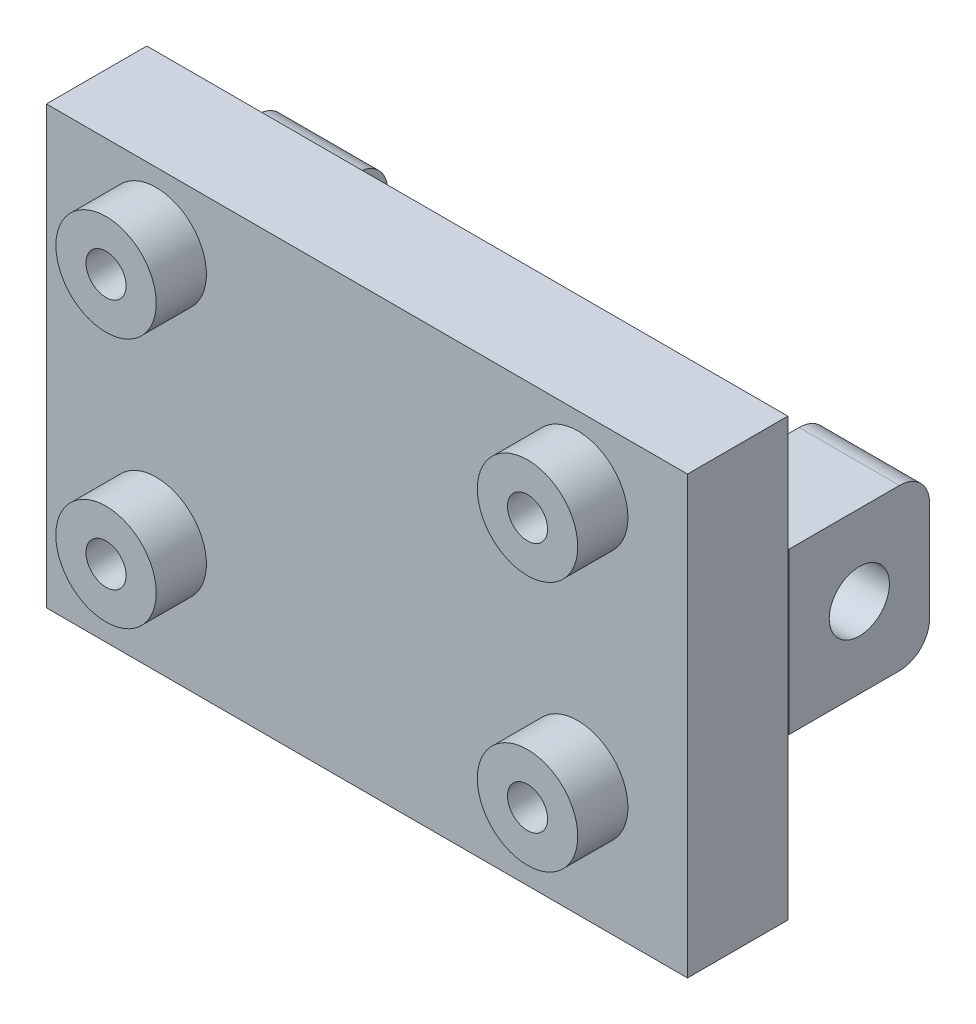
ISO-10303-21;
HEADER;
FILE_DESCRIPTION(('STEP AP214'),'2;1');
FILE_NAME('part.step','',(''),(''),'','','');
FILE_SCHEMA(('AUTOMOTIVE_DESIGN { 1 0 10303 214 1 1 1 1 }'));
ENDSEC;
DATA;
#1=APPLICATION_CONTEXT('core data for automotive mechanical design processes');
#2=APPLICATION_PROTOCOL_DEFINITION('international standard','automotive_design',2000,#1);
#3=PRODUCT_CONTEXT('',#1,'mechanical');
#4=PRODUCT('Part','Part','',(#3));
#5=PRODUCT_RELATED_PRODUCT_CATEGORY('part','',(#4));
#6=PRODUCT_DEFINITION_FORMATION('','',#4);
#7=PRODUCT_DEFINITION_CONTEXT('part definition',#1,'design');
#8=PRODUCT_DEFINITION('design','',#6,#7);
#9=PRODUCT_DEFINITION_SHAPE('','',#8);
#10=(LENGTH_UNIT() NAMED_UNIT(*) SI_UNIT(.MILLI.,.METRE.));
#11=(NAMED_UNIT(*) PLANE_ANGLE_UNIT() SI_UNIT($,.RADIAN.));
#12=(NAMED_UNIT(*) SI_UNIT($,.STERADIAN.) SOLID_ANGLE_UNIT());
#13=UNCERTAINTY_MEASURE_WITH_UNIT(LENGTH_MEASURE(1.E-05),#10,'distance_accuracy_value','');
#14=(GEOMETRIC_REPRESENTATION_CONTEXT(3) GLOBAL_UNCERTAINTY_ASSIGNED_CONTEXT((#13)) GLOBAL_UNIT_ASSIGNED_CONTEXT((#10,
#11,#12)) REPRESENTATION_CONTEXT('',''));
#15=CARTESIAN_POINT('',(0.,0.,0.));
#16=DIRECTION('',(0.,0.,1.));
#17=DIRECTION('',(1.,0.,0.));
#18=AXIS2_PLACEMENT_3D('',#15,#16,#17);
#19=CARTESIAN_POINT('',(0.,0.,5.));
#20=DIRECTION('',(0.,0.,-1.));
#21=DIRECTION('',(-1.,0.,0.));
#22=AXIS2_PLACEMENT_3D('',#19,#20,#21);
#23=PLANE('',#22);
#24=CARTESIAN_POINT('',(-10.5,6.25,5.));
#25=DIRECTION('',(0.,0.,-1.));
#26=DIRECTION('',(-1.,0.,0.));
#27=AXIS2_PLACEMENT_3D('',#24,#25,#26);
#28=CIRCLE('',#27,2.5);
#29=CARTESIAN_POINT('',(-13.,6.25,5.));
#30=VERTEX_POINT('',#29);
#31=EDGE_CURVE('E12',#30,#30,#28,.F.);
#32=ORIENTED_EDGE('',*,*,#31,.F.);
#33=EDGE_LOOP('',(#32));
#34=FACE_BOUND('',#33,.T.);
#35=CARTESIAN_POINT('',(10.5,6.25,5.));
#36=DIRECTION('',(0.,0.,-1.));
#37=DIRECTION('',(-1.,0.,0.));
#38=AXIS2_PLACEMENT_3D('',#35,#36,#37);
#39=CIRCLE('',#38,2.5);
#40=CARTESIAN_POINT('',(8.,6.25,5.));
#41=VERTEX_POINT('',#40);
#42=EDGE_CURVE('E52',#41,#41,#39,.F.);
#43=ORIENTED_EDGE('',*,*,#42,.F.);
#44=EDGE_LOOP('',(#43));
#45=FACE_BOUND('',#44,.T.);
#46=CARTESIAN_POINT('',(10.5,-6.25,5.));
#47=DIRECTION('',(0.,0.,-1.));
#48=DIRECTION('',(-1.,0.,0.));
#49=AXIS2_PLACEMENT_3D('',#46,#47,#48);
#50=CIRCLE('',#49,2.5);
#51=CARTESIAN_POINT('',(8.,-6.25,5.));
#52=VERTEX_POINT('',#51);
#53=EDGE_CURVE('E348',#52,#52,#50,.F.);
#54=ORIENTED_EDGE('',*,*,#53,.F.);
#55=EDGE_LOOP('',(#54));
#56=FACE_BOUND('',#55,.T.);
#57=CARTESIAN_POINT('',(-10.5,-6.25,5.));
#58=DIRECTION('',(0.,0.,-1.));
#59=DIRECTION('',(-1.,0.,0.));
#60=AXIS2_PLACEMENT_3D('',#57,#58,#59);
#61=CIRCLE('',#60,2.5);
#62=CARTESIAN_POINT('',(-13.,-6.25,5.));
#63=VERTEX_POINT('',#62);
#64=EDGE_CURVE('E345',#63,#63,#61,.F.);
#65=ORIENTED_EDGE('',*,*,#64,.F.);
#66=EDGE_LOOP('',(#65));
#67=FACE_BOUND('',#66,.T.);
#68=DIRECTION('',(0.,1.,0.));
#69=VECTOR('',#68,1.);
#70=CARTESIAN_POINT('',(15.9697448708061,-12.1254026242814,5.));
#71=LINE('',#70,#69);
#72=CARTESIAN_POINT('',(15.9697448708061,-12.1254026242814,5.));
#73=VERTEX_POINT('',#72);
#74=CARTESIAN_POINT('',(15.9697448708061,9.61880173970602,5.));
#75=VERTEX_POINT('',#74);
#76=EDGE_CURVE('E312',#73,#75,#71,.T.);
#77=ORIENTED_EDGE('',*,*,#76,.T.);
#78=DIRECTION('',(-1.,0.,0.));
#79=VECTOR('',#78,1.);
#80=CARTESIAN_POINT('',(-15.9697448708061,9.61880173970602,5.));
#81=LINE('',#80,#79);
#82=CARTESIAN_POINT('',(-15.9697448708061,9.61880173970602,5.));
#83=VERTEX_POINT('',#82);
#84=EDGE_CURVE('E315',#75,#83,#81,.T.);
#85=ORIENTED_EDGE('',*,*,#84,.T.);
#86=DIRECTION('',(0.,-1.,0.));
#87=VECTOR('',#86,1.);
#88=CARTESIAN_POINT('',(-15.9697448708061,-12.1254026242814,5.));
#89=LINE('',#88,#87);
#90=CARTESIAN_POINT('',(-15.9697448708061,-12.1254026242814,5.));
#91=VERTEX_POINT('',#90);
#92=EDGE_CURVE('E318',#83,#91,#89,.T.);
#93=ORIENTED_EDGE('',*,*,#92,.T.);
#94=DIRECTION('',(1.,0.,0.));
#95=VECTOR('',#94,1.);
#96=CARTESIAN_POINT('',(-15.9697448708061,-12.1254026242814,5.));
#97=LINE('',#96,#95);
#98=EDGE_CURVE('E320',#91,#73,#97,.T.);
#99=ORIENTED_EDGE('',*,*,#98,.T.);
#100=EDGE_LOOP('',(#77,#85,#93,#99));
#101=FACE_BOUND('',#100,.T.);
#102=ADVANCED_FACE('F44',(#34,#45,#56,#67,#101),#23,.F.);
#103=CARTESIAN_POINT('',(0.,0.,0.));
#104=DIRECTION('',(0.,0.,-1.));
#105=DIRECTION('',(-1.,0.,0.));
#106=AXIS2_PLACEMENT_3D('',#103,#104,#105);
#107=PLANE('',#106);
#108=DIRECTION('',(-1.,0.,0.));
#109=VECTOR('',#108,1.);
#110=CARTESIAN_POINT('',(16.0302551291939,-4.09125720677993,0.));
#111=LINE('',#110,#109);
#112=CARTESIAN_POINT('',(15.9697448708061,-4.09125720677993,0.));
#113=VERTEX_POINT('',#112);
#114=CARTESIAN_POINT('',(11.0302551291939,-4.09125720677993,0.));
#115=VERTEX_POINT('',#114);
#116=EDGE_CURVE('E219',#113,#115,#111,.T.);
#117=ORIENTED_EDGE('',*,*,#116,.F.);
#118=DIRECTION('',(0.,1.,0.));
#119=VECTOR('',#118,1.);
#120=CARTESIAN_POINT('',(15.9697448708061,-12.1254026242814,0.));
#121=LINE('',#120,#119);
#122=CARTESIAN_POINT('',(15.9697448708061,-12.1254026242814,0.));
#123=VERTEX_POINT('',#122);
#124=EDGE_CURVE('E323',#123,#113,#121,.T.);
#125=ORIENTED_EDGE('',*,*,#124,.F.);
#126=DIRECTION('',(1.,0.,0.));
#127=VECTOR('',#126,1.);
#128=CARTESIAN_POINT('',(-15.9697448708061,-12.1254026242814,0.));
#129=LINE('',#128,#127);
#130=CARTESIAN_POINT('',(-15.9697448708061,-12.1254026242814,0.));
#131=VERTEX_POINT('',#130);
#132=EDGE_CURVE('E316',#131,#123,#129,.T.);
#133=ORIENTED_EDGE('',*,*,#132,.F.);
#134=DIRECTION('',(0.,-1.,0.));
#135=VECTOR('',#134,1.);
#136=CARTESIAN_POINT('',(-15.9697448708061,-12.1254026242814,0.));
#137=LINE('',#136,#135);
#138=CARTESIAN_POINT('',(-15.9697448708061,-4.09125720677993,0.));
#139=VERTEX_POINT('',#138);
#140=EDGE_CURVE('E329',#139,#131,#137,.T.);
#141=ORIENTED_EDGE('',*,*,#140,.F.);
#142=DIRECTION('',(-1.,0.,0.));
#143=VECTOR('',#142,1.);
#144=CARTESIAN_POINT('',(-10.9697448708061,-4.09125720677993,0.));
#145=LINE('',#144,#143);
#146=CARTESIAN_POINT('',(-10.9697448708061,-4.09125720677993,0.));
#147=VERTEX_POINT('',#146);
#148=EDGE_CURVE('E264',#147,#139,#145,.T.);
#149=ORIENTED_EDGE('',*,*,#148,.F.);
#150=DIRECTION('',(0.,1.,0.));
#151=VECTOR('',#150,1.);
#152=CARTESIAN_POINT('',(-10.9697448708061,-4.09125720677993,0.));
#153=LINE('',#152,#151);
#154=CARTESIAN_POINT('',(-10.9697448708061,3.90874279322007,0.));
#155=VERTEX_POINT('',#154);
#156=EDGE_CURVE('E232',#147,#155,#153,.T.);
#157=ORIENTED_EDGE('',*,*,#156,.T.);
#158=DIRECTION('',(-1.,0.,0.));
#159=VECTOR('',#158,1.);
#160=CARTESIAN_POINT('',(-10.9697448708061,3.90874279322007,0.));
#161=LINE('',#160,#159);
#162=CARTESIAN_POINT('',(-15.9697448708061,3.90874279322007,0.));
#163=VERTEX_POINT('',#162);
#164=EDGE_CURVE('E251',#155,#163,#161,.T.);
#165=ORIENTED_EDGE('',*,*,#164,.T.);
#166=CARTESIAN_POINT('',(-15.9697448708061,9.61880173970602,0.));
#167=VERTEX_POINT('',#166);
#168=EDGE_CURVE('E330',#167,#163,#137,.T.);
#169=ORIENTED_EDGE('',*,*,#168,.F.);
#170=DIRECTION('',(-1.,0.,0.));
#171=VECTOR('',#170,1.);
#172=CARTESIAN_POINT('',(-15.9697448708061,9.61880173970602,0.));
#173=LINE('',#172,#171);
#174=CARTESIAN_POINT('',(15.9697448708061,9.61880173970602,0.));
#175=VERTEX_POINT('',#174);
#176=EDGE_CURVE('E326',#175,#167,#173,.T.);
#177=ORIENTED_EDGE('',*,*,#176,.F.);
#178=CARTESIAN_POINT('',(15.9697448708061,3.90874279322007,0.));
#179=VERTEX_POINT('',#178);
#180=EDGE_CURVE('E311',#179,#175,#121,.T.);
#181=ORIENTED_EDGE('',*,*,#180,.F.);
#182=DIRECTION('',(-1.,0.,0.));
#183=VECTOR('',#182,1.);
#184=CARTESIAN_POINT('',(16.0302551291939,3.90874279322007,0.));
#185=LINE('',#184,#183);
#186=CARTESIAN_POINT('',(11.0302551291939,3.90874279322007,0.));
#187=VERTEX_POINT('',#186);
#188=EDGE_CURVE('E166',#179,#187,#185,.T.);
#189=ORIENTED_EDGE('',*,*,#188,.T.);
#190=DIRECTION('',(0.,1.,0.));
#191=VECTOR('',#190,1.);
#192=CARTESIAN_POINT('',(11.0302551291939,-4.09125720677993,0.));
#193=LINE('',#192,#191);
#194=EDGE_CURVE('E202',#115,#187,#193,.T.);
#195=ORIENTED_EDGE('',*,*,#194,.F.);
#196=EDGE_LOOP('',(#117,#125,#133,#141,#149,#157,#165,#169,#177,#181,#189,#195));
#197=FACE_BOUND('',#196,.T.);
#198=CARTESIAN_POINT('',(-10.5,-6.25,0.));
#199=DIRECTION('',(0.,0.,1.));
#200=DIRECTION('',(1.,0.,0.));
#201=AXIS2_PLACEMENT_3D('',#198,#199,#200);
#202=CIRCLE('',#201,1.);
#203=CARTESIAN_POINT('',(-9.5,-6.25,0.));
#204=VERTEX_POINT('',#203);
#205=EDGE_CURVE('E302',#204,#204,#202,.T.);
#206=ORIENTED_EDGE('',*,*,#205,.T.);
#207=EDGE_LOOP('',(#206));
#208=FACE_BOUND('',#207,.T.);
#209=CARTESIAN_POINT('',(10.5,6.25,0.));
#210=DIRECTION('',(0.,0.,1.));
#211=DIRECTION('',(1.,0.,0.));
#212=AXIS2_PLACEMENT_3D('',#209,#210,#211);
#213=CIRCLE('',#212,1.);
#214=CARTESIAN_POINT('',(11.5,6.25,0.));
#215=VERTEX_POINT('',#214);
#216=EDGE_CURVE('E308',#215,#215,#213,.T.);
#217=ORIENTED_EDGE('',*,*,#216,.T.);
#218=EDGE_LOOP('',(#217));
#219=FACE_BOUND('',#218,.T.);
#220=CARTESIAN_POINT('',(10.5,-6.25,0.));
#221=DIRECTION('',(0.,0.,1.));
#222=DIRECTION('',(1.,0.,0.));
#223=AXIS2_PLACEMENT_3D('',#220,#221,#222);
#224=CIRCLE('',#223,1.);
#225=CARTESIAN_POINT('',(11.5,-6.25,0.));
#226=VERTEX_POINT('',#225);
#227=EDGE_CURVE('E305',#226,#226,#224,.T.);
#228=ORIENTED_EDGE('',*,*,#227,.T.);
#229=EDGE_LOOP('',(#228));
#230=FACE_BOUND('',#229,.T.);
#231=CARTESIAN_POINT('',(-10.5,6.25,0.));
#232=DIRECTION('',(0.,0.,1.));
#233=DIRECTION('',(1.,0.,0.));
#234=AXIS2_PLACEMENT_3D('',#231,#232,#233);
#235=CIRCLE('',#234,1.);
#236=CARTESIAN_POINT('',(-9.5,6.25,0.));
#237=VERTEX_POINT('',#236);
#238=EDGE_CURVE('E299',#237,#237,#235,.T.);
#239=ORIENTED_EDGE('',*,*,#238,.T.);
#240=EDGE_LOOP('',(#239));
#241=FACE_BOUND('',#240,.T.);
#242=ADVANCED_FACE('F357',(#197,#208,#219,#230,#241),#107,.T.);
#243=CARTESIAN_POINT('',(15.9697448708061,-12.1254026242814,5.));
#244=DIRECTION('',(-1.,0.,0.));
#245=DIRECTION('',(0.,0.,1.));
#246=AXIS2_PLACEMENT_3D('',#243,#244,#245);
#247=PLANE('',#246);
#248=ORIENTED_EDGE('',*,*,#124,.T.);
#249=EDGE_CURVE('E327',#113,#179,#121,.T.);
#250=ORIENTED_EDGE('',*,*,#249,.T.);
#251=ORIENTED_EDGE('',*,*,#180,.T.);
#252=DIRECTION('',(0.,0.,-1.));
#253=VECTOR('',#252,1.);
#254=CARTESIAN_POINT('',(15.9697448708061,9.61880173970602,5.));
#255=LINE('',#254,#253);
#256=EDGE_CURVE('E342',#75,#175,#255,.T.);
#257=ORIENTED_EDGE('',*,*,#256,.F.);
#258=ORIENTED_EDGE('',*,*,#76,.F.);
#259=DIRECTION('',(0.,0.,-1.));
#260=VECTOR('',#259,1.);
#261=CARTESIAN_POINT('',(15.9697448708061,-12.1254026242814,5.));
#262=LINE('',#261,#260);
#263=EDGE_CURVE('E322',#73,#123,#262,.T.);
#264=ORIENTED_EDGE('',*,*,#263,.T.);
#265=EDGE_LOOP('',(#248,#250,#251,#257,#258,#264));
#266=FACE_BOUND('',#265,.T.);
#267=ADVANCED_FACE('F46',(#266),#247,.F.);
#268=CARTESIAN_POINT('',(-15.9697448708061,9.61880173970602,5.));
#269=DIRECTION('',(0.,-1.,0.));
#270=DIRECTION('',(0.,0.,-1.));
#271=AXIS2_PLACEMENT_3D('',#268,#269,#270);
#272=PLANE('',#271);
#273=ORIENTED_EDGE('',*,*,#176,.T.);
#274=DIRECTION('',(0.,0.,-1.));
#275=VECTOR('',#274,1.);
#276=CARTESIAN_POINT('',(-15.9697448708061,9.61880173970602,5.));
#277=LINE('',#276,#275);
#278=EDGE_CURVE('E339',#83,#167,#277,.T.);
#279=ORIENTED_EDGE('',*,*,#278,.F.);
#280=ORIENTED_EDGE('',*,*,#84,.F.);
#281=ORIENTED_EDGE('',*,*,#256,.T.);
#282=EDGE_LOOP('',(#273,#279,#280,#281));
#283=FACE_BOUND('',#282,.T.);
#284=ADVANCED_FACE('F373',(#283),#272,.F.);
#285=CARTESIAN_POINT('',(-15.9697448708061,-12.1254026242814,5.));
#286=DIRECTION('',(1.,0.,0.));
#287=DIRECTION('',(0.,0.,-1.));
#288=AXIS2_PLACEMENT_3D('',#285,#286,#287);
#289=PLANE('',#288);
#290=ORIENTED_EDGE('',*,*,#168,.T.);
#291=DIRECTION('',(0.,0.,-1.));
#292=VECTOR('',#291,1.);
#293=CARTESIAN_POINT('',(-15.9697448708061,3.90874279322007,-5.5));
#294=LINE('',#293,#292);
#295=CARTESIAN_POINT('',(-15.9697448708061,3.90874279322007,-5.5));
#296=VERTEX_POINT('',#295);
#297=EDGE_CURVE('E67',#163,#296,#294,.T.);
#298=ORIENTED_EDGE('',*,*,#297,.T.);
#299=CARTESIAN_POINT('',(-15.9697448708061,2.40874279322007,-5.5));
#300=DIRECTION('',(-1.,0.,0.));
#301=DIRECTION('',(0.,0.,-1.));
#302=AXIS2_PLACEMENT_3D('',#299,#300,#301);
#303=CIRCLE('',#302,1.5);
#304=CARTESIAN_POINT('',(-15.9697448708061,2.40874279322007,-7.));
#305=VERTEX_POINT('',#304);
#306=EDGE_CURVE('E253',#296,#305,#303,.T.);
#307=ORIENTED_EDGE('',*,*,#306,.T.);
#308=DIRECTION('',(0.,-1.,0.));
#309=VECTOR('',#308,1.);
#310=CARTESIAN_POINT('',(-15.9697448708061,-2.59125720677993,-7.));
#311=LINE('',#310,#309);
#312=CARTESIAN_POINT('',(-15.9697448708061,-2.59125720677993,-7.));
#313=VERTEX_POINT('',#312);
#314=EDGE_CURVE('E256',#305,#313,#311,.T.);
#315=ORIENTED_EDGE('',*,*,#314,.T.);
#316=CARTESIAN_POINT('',(-15.9697448708061,-2.59125720677993,-5.5));
#317=DIRECTION('',(-1.,0.,0.));
#318=DIRECTION('',(0.,0.,-1.));
#319=AXIS2_PLACEMENT_3D('',#316,#317,#318);
#320=CIRCLE('',#319,1.5);
#321=CARTESIAN_POINT('',(-15.9697448708061,-4.09125720677993,-5.5));
#322=VERTEX_POINT('',#321);
#323=EDGE_CURVE('E259',#313,#322,#320,.T.);
#324=ORIENTED_EDGE('',*,*,#323,.T.);
#325=DIRECTION('',(0.,0.,1.));
#326=VECTOR('',#325,1.);
#327=CARTESIAN_POINT('',(-15.9697448708061,-4.09125720677993,0.));
#328=LINE('',#327,#326);
#329=EDGE_CURVE('E236',#322,#139,#328,.T.);
#330=ORIENTED_EDGE('',*,*,#329,.T.);
#331=ORIENTED_EDGE('',*,*,#140,.T.);
#332=DIRECTION('',(0.,0.,-1.));
#333=VECTOR('',#332,1.);
#334=CARTESIAN_POINT('',(-15.9697448708061,-12.1254026242814,5.));
#335=LINE('',#334,#333);
#336=EDGE_CURVE('E336',#91,#131,#335,.T.);
#337=ORIENTED_EDGE('',*,*,#336,.F.);
#338=ORIENTED_EDGE('',*,*,#92,.F.);
#339=ORIENTED_EDGE('',*,*,#278,.T.);
#340=EDGE_LOOP('',(#290,#298,#307,#315,#324,#330,#331,#337,#338,#339));
#341=FACE_BOUND('',#340,.T.);
#342=CARTESIAN_POINT('',(-15.9697448708061,-0.0912572067799326,-3.5));
#343=DIRECTION('',(-1.,0.,0.));
#344=DIRECTION('',(0.,0.,1.));
#345=AXIS2_PLACEMENT_3D('',#342,#343,#344);
#346=CIRCLE('',#345,1.5);
#347=CARTESIAN_POINT('',(-15.9697448708061,-0.0912572067799326,-2.));
#348=VERTEX_POINT('',#347);
#349=EDGE_CURVE('E218',#348,#348,#346,.T.);
#350=ORIENTED_EDGE('',*,*,#349,.F.);
#351=EDGE_LOOP('',(#350));
#352=FACE_BOUND('',#351,.T.);
#353=ADVANCED_FACE('F378',(#341,#352),#289,.F.);
#354=CARTESIAN_POINT('',(-15.9697448708061,-12.1254026242814,5.));
#355=DIRECTION('',(0.,1.,0.));
#356=DIRECTION('',(0.,0.,1.));
#357=AXIS2_PLACEMENT_3D('',#354,#355,#356);
#358=PLANE('',#357);
#359=ORIENTED_EDGE('',*,*,#132,.T.);
#360=ORIENTED_EDGE('',*,*,#263,.F.);
#361=ORIENTED_EDGE('',*,*,#98,.F.);
#362=ORIENTED_EDGE('',*,*,#336,.T.);
#363=EDGE_LOOP('',(#359,#360,#361,#362));
#364=FACE_BOUND('',#363,.T.);
#365=ADVANCED_FACE('F383',(#364),#358,.F.);
#366=CARTESIAN_POINT('',(10.5,6.25,5.));
#367=DIRECTION('',(0.,0.,-1.));
#368=DIRECTION('',(-1.,0.,0.));
#369=AXIS2_PLACEMENT_3D('',#366,#367,#368);
#370=CYLINDRICAL_SURFACE('',#369,1.);
#371=ORIENTED_EDGE('',*,*,#216,.F.);
#372=EDGE_LOOP('',(#371));
#373=FACE_BOUND('',#372,.T.);
#374=CARTESIAN_POINT('',(10.5,6.25,7.5));
#375=DIRECTION('',(0.,0.,1.));
#376=DIRECTION('',(1.,0.,0.));
#377=AXIS2_PLACEMENT_3D('',#374,#375,#376);
#378=CIRCLE('',#377,1.);
#379=CARTESIAN_POINT('',(11.5,6.25,7.5));
#380=VERTEX_POINT('',#379);
#381=EDGE_CURVE('E280',#380,#380,#378,.F.);
#382=ORIENTED_EDGE('',*,*,#381,.F.);
#383=EDGE_LOOP('',(#382));
#384=FACE_BOUND('',#383,.T.);
#385=ADVANCED_FACE('F485',(#373,#384),#370,.F.);
#386=CARTESIAN_POINT('',(10.5,-6.25,5.));
#387=DIRECTION('',(0.,0.,-1.));
#388=DIRECTION('',(-1.,0.,0.));
#389=AXIS2_PLACEMENT_3D('',#386,#387,#388);
#390=CYLINDRICAL_SURFACE('',#389,1.);
#391=ORIENTED_EDGE('',*,*,#227,.F.);
#392=EDGE_LOOP('',(#391));
#393=FACE_BOUND('',#392,.T.);
#394=CARTESIAN_POINT('',(10.5,-6.25,7.5));
#395=DIRECTION('',(0.,0.,1.));
#396=DIRECTION('',(1.,0.,0.));
#397=AXIS2_PLACEMENT_3D('',#394,#395,#396);
#398=CIRCLE('',#397,1.);
#399=CARTESIAN_POINT('',(11.5,-6.25,7.5));
#400=VERTEX_POINT('',#399);
#401=EDGE_CURVE('E279',#400,#400,#398,.F.);
#402=ORIENTED_EDGE('',*,*,#401,.F.);
#403=EDGE_LOOP('',(#402));
#404=FACE_BOUND('',#403,.T.);
#405=ADVANCED_FACE('F481',(#393,#404),#390,.F.);
#406=CARTESIAN_POINT('',(-10.5,-6.25,5.));
#407=DIRECTION('',(0.,0.,-1.));
#408=DIRECTION('',(-1.,0.,0.));
#409=AXIS2_PLACEMENT_3D('',#406,#407,#408);
#410=CYLINDRICAL_SURFACE('',#409,1.);
#411=ORIENTED_EDGE('',*,*,#205,.F.);
#412=EDGE_LOOP('',(#411));
#413=FACE_BOUND('',#412,.T.);
#414=CARTESIAN_POINT('',(-10.5,-6.25,7.5));
#415=DIRECTION('',(0.,0.,1.));
#416=DIRECTION('',(1.,0.,0.));
#417=AXIS2_PLACEMENT_3D('',#414,#415,#416);
#418=CIRCLE('',#417,1.);
#419=CARTESIAN_POINT('',(-9.5,-6.25,7.5));
#420=VERTEX_POINT('',#419);
#421=EDGE_CURVE('E283',#420,#420,#418,.F.);
#422=ORIENTED_EDGE('',*,*,#421,.F.);
#423=EDGE_LOOP('',(#422));
#424=FACE_BOUND('',#423,.T.);
#425=ADVANCED_FACE('F477',(#413,#424),#410,.F.);
#426=CARTESIAN_POINT('',(-10.5,6.25,5.));
#427=DIRECTION('',(0.,0.,-1.));
#428=DIRECTION('',(-1.,0.,0.));
#429=AXIS2_PLACEMENT_3D('',#426,#427,#428);
#430=CYLINDRICAL_SURFACE('',#429,1.);
#431=ORIENTED_EDGE('',*,*,#238,.F.);
#432=EDGE_LOOP('',(#431));
#433=FACE_BOUND('',#432,.T.);
#434=CARTESIAN_POINT('',(-10.5,6.25,7.5));
#435=DIRECTION('',(0.,0.,1.));
#436=DIRECTION('',(1.,0.,0.));
#437=AXIS2_PLACEMENT_3D('',#434,#435,#436);
#438=CIRCLE('',#437,1.);
#439=CARTESIAN_POINT('',(-9.5,6.25,7.5));
#440=VERTEX_POINT('',#439);
#441=EDGE_CURVE('E287',#440,#440,#438,.T.);
#442=ORIENTED_EDGE('',*,*,#441,.T.);
#443=EDGE_LOOP('',(#442));
#444=FACE_BOUND('',#443,.T.);
#445=ADVANCED_FACE('F467',(#433,#444),#430,.F.);
#446=CARTESIAN_POINT('',(-10.5,6.25,7.5));
#447=DIRECTION('',(0.,0.,1.));
#448=DIRECTION('',(1.,0.,0.));
#449=AXIS2_PLACEMENT_3D('',#446,#447,#448);
#450=PLANE('',#449);
#451=CARTESIAN_POINT('',(-10.5,6.25,7.5));
#452=DIRECTION('',(0.,0.,1.));
#453=DIRECTION('',(1.,0.,0.));
#454=AXIS2_PLACEMENT_3D('',#451,#452,#453);
#455=CIRCLE('',#454,2.5);
#456=CARTESIAN_POINT('',(-8.,6.25,7.5));
#457=VERTEX_POINT('',#456);
#458=EDGE_CURVE('E266',#457,#457,#455,.T.);
#459=ORIENTED_EDGE('',*,*,#458,.T.);
#460=EDGE_LOOP('',(#459));
#461=FACE_BOUND('',#460,.T.);
#462=ORIENTED_EDGE('',*,*,#441,.F.);
#463=EDGE_LOOP('',(#462));
#464=FACE_BOUND('',#463,.T.);
#465=ADVANCED_FACE('F463',(#461,#464),#450,.T.);
#466=CARTESIAN_POINT('',(-10.5,6.25,7.5));
#467=DIRECTION('',(0.,0.,-1.));
#468=DIRECTION('',(-1.,0.,0.));
#469=AXIS2_PLACEMENT_3D('',#466,#467,#468);
#470=CYLINDRICAL_SURFACE('',#469,2.5);
#471=ORIENTED_EDGE('',*,*,#458,.F.);
#472=EDGE_LOOP('',(#471));
#473=FACE_BOUND('',#472,.T.);
#474=ORIENTED_EDGE('',*,*,#31,.T.);
#475=EDGE_LOOP('',(#474));
#476=FACE_BOUND('',#475,.T.);
#477=ADVANCED_FACE('F459',(#473,#476),#470,.T.);
#478=CARTESIAN_POINT('',(-10.5,-6.25,7.5));
#479=DIRECTION('',(0.,0.,-1.));
#480=DIRECTION('',(-1.,0.,0.));
#481=AXIS2_PLACEMENT_3D('',#478,#479,#480);
#482=CYLINDRICAL_SURFACE('',#481,2.5);
#483=CARTESIAN_POINT('',(-10.5,-6.25,7.5));
#484=DIRECTION('',(0.,0.,1.));
#485=DIRECTION('',(1.,0.,0.));
#486=AXIS2_PLACEMENT_3D('',#483,#484,#485);
#487=CIRCLE('',#486,2.5);
#488=CARTESIAN_POINT('',(-8.,-6.25,7.5));
#489=VERTEX_POINT('',#488);
#490=EDGE_CURVE('E296',#489,#489,#487,.T.);
#491=ORIENTED_EDGE('',*,*,#490,.F.);
#492=EDGE_LOOP('',(#491));
#493=FACE_BOUND('',#492,.T.);
#494=ORIENTED_EDGE('',*,*,#64,.T.);
#495=EDGE_LOOP('',(#494));
#496=FACE_BOUND('',#495,.T.);
#497=ADVANCED_FACE('F462',(#493,#496),#482,.T.);
#498=CARTESIAN_POINT('',(0.,0.,7.5));
#499=DIRECTION('',(0.,0.,1.));
#500=DIRECTION('',(1.,0.,0.));
#501=AXIS2_PLACEMENT_3D('',#498,#499,#500);
#502=PLANE('',#501);
#503=ORIENTED_EDGE('',*,*,#421,.T.);
#504=EDGE_LOOP('',(#503));
#505=FACE_BOUND('',#504,.T.);
#506=ORIENTED_EDGE('',*,*,#490,.T.);
#507=EDGE_LOOP('',(#506));
#508=FACE_BOUND('',#507,.T.);
#509=ADVANCED_FACE('F448',(#505,#508),#502,.T.);
#510=CARTESIAN_POINT('',(10.5,-6.25,7.5));
#511=DIRECTION('',(0.,0.,-1.));
#512=DIRECTION('',(-1.,0.,0.));
#513=AXIS2_PLACEMENT_3D('',#510,#511,#512);
#514=CYLINDRICAL_SURFACE('',#513,2.5);
#515=CARTESIAN_POINT('',(10.5,-6.25,7.5));
#516=DIRECTION('',(0.,0.,1.));
#517=DIRECTION('',(1.,0.,0.));
#518=AXIS2_PLACEMENT_3D('',#515,#516,#517);
#519=CIRCLE('',#518,2.5);
#520=CARTESIAN_POINT('',(13.,-6.25,7.5));
#521=VERTEX_POINT('',#520);
#522=EDGE_CURVE('E276',#521,#521,#519,.T.);
#523=ORIENTED_EDGE('',*,*,#522,.F.);
#524=EDGE_LOOP('',(#523));
#525=FACE_BOUND('',#524,.T.);
#526=ORIENTED_EDGE('',*,*,#53,.T.);
#527=EDGE_LOOP('',(#526));
#528=FACE_BOUND('',#527,.T.);
#529=ADVANCED_FACE('F444',(#525,#528),#514,.T.);
#530=CARTESIAN_POINT('',(0.,0.,7.5));
#531=DIRECTION('',(0.,0.,1.));
#532=DIRECTION('',(1.,0.,0.));
#533=AXIS2_PLACEMENT_3D('',#530,#531,#532);
#534=PLANE('',#533);
#535=ORIENTED_EDGE('',*,*,#401,.T.);
#536=EDGE_LOOP('',(#535));
#537=FACE_BOUND('',#536,.T.);
#538=ORIENTED_EDGE('',*,*,#522,.T.);
#539=EDGE_LOOP('',(#538));
#540=FACE_BOUND('',#539,.T.);
#541=ADVANCED_FACE('F447',(#537,#540),#534,.T.);
#542=CARTESIAN_POINT('',(10.5,6.25,7.5));
#543=DIRECTION('',(0.,0.,-1.));
#544=DIRECTION('',(-1.,0.,0.));
#545=AXIS2_PLACEMENT_3D('',#542,#543,#544);
#546=CYLINDRICAL_SURFACE('',#545,2.5);
#547=CARTESIAN_POINT('',(10.5,6.25,7.5));
#548=DIRECTION('',(0.,0.,1.));
#549=DIRECTION('',(1.,0.,0.));
#550=AXIS2_PLACEMENT_3D('',#547,#548,#549);
#551=CIRCLE('',#550,2.5);
#552=CARTESIAN_POINT('',(13.,6.25,7.5));
#553=VERTEX_POINT('',#552);
#554=EDGE_CURVE('E284',#553,#553,#551,.T.);
#555=ORIENTED_EDGE('',*,*,#554,.F.);
#556=EDGE_LOOP('',(#555));
#557=FACE_BOUND('',#556,.T.);
#558=ORIENTED_EDGE('',*,*,#42,.T.);
#559=EDGE_LOOP('',(#558));
#560=FACE_BOUND('',#559,.T.);
#561=ADVANCED_FACE('F353',(#557,#560),#546,.T.);
#562=CARTESIAN_POINT('',(0.,0.,7.5));
#563=DIRECTION('',(0.,0.,1.));
#564=DIRECTION('',(1.,0.,0.));
#565=AXIS2_PLACEMENT_3D('',#562,#563,#564);
#566=PLANE('',#565);
#567=ORIENTED_EDGE('',*,*,#381,.T.);
#568=EDGE_LOOP('',(#567));
#569=FACE_BOUND('',#568,.T.);
#570=ORIENTED_EDGE('',*,*,#554,.T.);
#571=EDGE_LOOP('',(#570));
#572=FACE_BOUND('',#571,.T.);
#573=ADVANCED_FACE('F429',(#569,#572),#566,.T.);
#574=CARTESIAN_POINT('',(-10.9697448708061,-4.09125720677993,0.));
#575=DIRECTION('',(0.,-1.,0.));
#576=DIRECTION('',(0.,0.,-1.));
#577=AXIS2_PLACEMENT_3D('',#574,#575,#576);
#578=PLANE('',#577);
#579=ORIENTED_EDGE('',*,*,#329,.F.);
#580=DIRECTION('',(-1.,0.,0.));
#581=VECTOR('',#580,1.);
#582=CARTESIAN_POINT('',(-10.9697448708061,-4.09125720677993,-5.5));
#583=LINE('',#582,#581);
#584=CARTESIAN_POINT('',(-10.9697448708061,-4.09125720677993,-5.5));
#585=VERTEX_POINT('',#584);
#586=EDGE_CURVE('E267',#585,#322,#583,.T.);
#587=ORIENTED_EDGE('',*,*,#586,.F.);
#588=DIRECTION('',(0.,0.,1.));
#589=VECTOR('',#588,1.);
#590=CARTESIAN_POINT('',(-10.9697448708061,-4.09125720677993,0.));
#591=LINE('',#590,#589);
#592=EDGE_CURVE('E248',#585,#147,#591,.T.);
#593=ORIENTED_EDGE('',*,*,#592,.T.);
#594=ORIENTED_EDGE('',*,*,#148,.T.);
#595=EDGE_LOOP('',(#579,#587,#593,#594));
#596=FACE_BOUND('',#595,.T.);
#597=ADVANCED_FACE('F425',(#596),#578,.T.);
#598=CARTESIAN_POINT('',(-10.9697448708061,-2.59125720677993,-5.5));
#599=DIRECTION('',(-1.,0.,0.));
#600=DIRECTION('',(0.,0.,1.));
#601=AXIS2_PLACEMENT_3D('',#598,#599,#600);
#602=CYLINDRICAL_SURFACE('',#601,1.5);
#603=ORIENTED_EDGE('',*,*,#323,.F.);
#604=DIRECTION('',(-1.,0.,0.));
#605=VECTOR('',#604,1.);
#606=CARTESIAN_POINT('',(-10.9697448708061,-2.59125720677993,-7.));
#607=LINE('',#606,#605);
#608=CARTESIAN_POINT('',(-10.9697448708061,-2.59125720677993,-7.));
#609=VERTEX_POINT('',#608);
#610=EDGE_CURVE('E269',#609,#313,#607,.T.);
#611=ORIENTED_EDGE('',*,*,#610,.F.);
#612=CARTESIAN_POINT('',(-10.9697448708061,-2.59125720677993,-5.5));
#613=DIRECTION('',(-1.,0.,0.));
#614=DIRECTION('',(0.,0.,-1.));
#615=AXIS2_PLACEMENT_3D('',#612,#613,#614);
#616=CIRCLE('',#615,1.5);
#617=EDGE_CURVE('E245',#609,#585,#616,.T.);
#618=ORIENTED_EDGE('',*,*,#617,.T.);
#619=ORIENTED_EDGE('',*,*,#586,.T.);
#620=EDGE_LOOP('',(#603,#611,#618,#619));
#621=FACE_BOUND('',#620,.T.);
#622=ADVANCED_FACE('F428',(#621),#602,.T.);
#623=CARTESIAN_POINT('',(-10.9697448708061,-2.59125720677993,-7.));
#624=DIRECTION('',(0.,0.,-1.));
#625=DIRECTION('',(-1.,0.,0.));
#626=AXIS2_PLACEMENT_3D('',#623,#624,#625);
#627=PLANE('',#626);
#628=ORIENTED_EDGE('',*,*,#314,.F.);
#629=DIRECTION('',(-1.,0.,0.));
#630=VECTOR('',#629,1.);
#631=CARTESIAN_POINT('',(-10.9697448708061,2.40874279322007,-7.));
#632=LINE('',#631,#630);
#633=CARTESIAN_POINT('',(-10.9697448708061,2.40874279322007,-7.));
#634=VERTEX_POINT('',#633);
#635=EDGE_CURVE('E271',#634,#305,#632,.T.);
#636=ORIENTED_EDGE('',*,*,#635,.F.);
#637=DIRECTION('',(0.,-1.,0.));
#638=VECTOR('',#637,1.);
#639=CARTESIAN_POINT('',(-10.9697448708061,-2.59125720677993,-7.));
#640=LINE('',#639,#638);
#641=EDGE_CURVE('E242',#634,#609,#640,.T.);
#642=ORIENTED_EDGE('',*,*,#641,.T.);
#643=ORIENTED_EDGE('',*,*,#610,.T.);
#644=EDGE_LOOP('',(#628,#636,#642,#643));
#645=FACE_BOUND('',#644,.T.);
#646=ADVANCED_FACE('F433',(#645),#627,.T.);
#647=CARTESIAN_POINT('',(-10.9697448708061,2.40874279322007,-5.5));
#648=DIRECTION('',(-1.,0.,0.));
#649=DIRECTION('',(0.,0.,1.));
#650=AXIS2_PLACEMENT_3D('',#647,#648,#649);
#651=CYLINDRICAL_SURFACE('',#650,1.5);
#652=ORIENTED_EDGE('',*,*,#306,.F.);
#653=DIRECTION('',(-1.,0.,0.));
#654=VECTOR('',#653,1.);
#655=CARTESIAN_POINT('',(-10.9697448708061,3.90874279322007,-5.5));
#656=LINE('',#655,#654);
#657=CARTESIAN_POINT('',(-10.9697448708061,3.90874279322007,-5.5));
#658=VERTEX_POINT('',#657);
#659=EDGE_CURVE('E273',#658,#296,#656,.T.);
#660=ORIENTED_EDGE('',*,*,#659,.F.);
#661=CARTESIAN_POINT('',(-10.9697448708061,2.40874279322007,-5.5));
#662=DIRECTION('',(-1.,0.,0.));
#663=DIRECTION('',(0.,0.,-1.));
#664=AXIS2_PLACEMENT_3D('',#661,#662,#663);
#665=CIRCLE('',#664,1.5);
#666=EDGE_CURVE('E239',#658,#634,#665,.T.);
#667=ORIENTED_EDGE('',*,*,#666,.T.);
#668=ORIENTED_EDGE('',*,*,#635,.T.);
#669=EDGE_LOOP('',(#652,#660,#667,#668));
#670=FACE_BOUND('',#669,.T.);
#671=ADVANCED_FACE('F437',(#670),#651,.T.);
#672=CARTESIAN_POINT('',(-10.9697448708061,3.90874279322007,-5.5));
#673=DIRECTION('',(0.,1.,0.));
#674=DIRECTION('',(0.,0.,1.));
#675=AXIS2_PLACEMENT_3D('',#672,#673,#674);
#676=PLANE('',#675);
#677=ORIENTED_EDGE('',*,*,#297,.F.);
#678=ORIENTED_EDGE('',*,*,#164,.F.);
#679=DIRECTION('',(0.,0.,-1.));
#680=VECTOR('',#679,1.);
#681=CARTESIAN_POINT('',(-10.9697448708061,3.90874279322007,-5.5));
#682=LINE('',#681,#680);
#683=EDGE_CURVE('E235',#155,#658,#682,.T.);
#684=ORIENTED_EDGE('',*,*,#683,.T.);
#685=ORIENTED_EDGE('',*,*,#659,.T.);
#686=EDGE_LOOP('',(#677,#678,#684,#685));
#687=FACE_BOUND('',#686,.T.);
#688=ADVANCED_FACE('F423',(#687),#676,.T.);
#689=CARTESIAN_POINT('',(-10.9697448708061,2.40874279322007,-5.5));
#690=DIRECTION('',(1.,0.,0.));
#691=DIRECTION('',(0.,0.,-1.));
#692=AXIS2_PLACEMENT_3D('',#689,#690,#691);
#693=PLANE('',#692);
#694=CARTESIAN_POINT('',(-10.9697448708061,-0.0912572067799326,-3.5));
#695=DIRECTION('',(-1.,0.,0.));
#696=DIRECTION('',(0.,0.,1.));
#697=AXIS2_PLACEMENT_3D('',#694,#695,#696);
#698=CIRCLE('',#697,1.5);
#699=CARTESIAN_POINT('',(-10.9697448708061,-0.0912572067799326,-2.));
#700=VERTEX_POINT('',#699);
#701=EDGE_CURVE('E227',#700,#700,#698,.T.);
#702=ORIENTED_EDGE('',*,*,#701,.T.);
#703=EDGE_LOOP('',(#702));
#704=FACE_BOUND('',#703,.T.);
#705=ORIENTED_EDGE('',*,*,#156,.F.);
#706=ORIENTED_EDGE('',*,*,#592,.F.);
#707=ORIENTED_EDGE('',*,*,#617,.F.);
#708=ORIENTED_EDGE('',*,*,#641,.F.);
#709=ORIENTED_EDGE('',*,*,#666,.F.);
#710=ORIENTED_EDGE('',*,*,#683,.F.);
#711=EDGE_LOOP('',(#705,#706,#707,#708,#709,#710));
#712=FACE_BOUND('',#711,.T.);
#713=ADVANCED_FACE('F419',(#704,#712),#693,.T.);
#714=CARTESIAN_POINT('',(-10.9697448708061,-0.0912572067799326,-3.5));
#715=DIRECTION('',(-1.,0.,0.));
#716=DIRECTION('',(0.,0.,1.));
#717=AXIS2_PLACEMENT_3D('',#714,#715,#716);
#718=CYLINDRICAL_SURFACE('',#717,1.5);
#719=ORIENTED_EDGE('',*,*,#701,.F.);
#720=EDGE_LOOP('',(#719));
#721=FACE_BOUND('',#720,.T.);
#722=ORIENTED_EDGE('',*,*,#349,.T.);
#723=EDGE_LOOP('',(#722));
#724=FACE_BOUND('',#723,.T.);
#725=ADVANCED_FACE('F416',(#721,#724),#718,.F.);
#726=CARTESIAN_POINT('',(16.0302551291939,-4.09125720677993,0.));
#727=DIRECTION('',(0.,0.,1.));
#728=DIRECTION('',(1.,0.,0.));
#729=AXIS2_PLACEMENT_3D('',#726,#727,#728);
#730=PLANE('',#729);
#731=ORIENTED_EDGE('',*,*,#249,.F.);
#732=CARTESIAN_POINT('',(16.0302551291939,-4.09125720677993,0.));
#733=VERTEX_POINT('',#732);
#734=EDGE_CURVE('E183',#733,#113,#111,.T.);
#735=ORIENTED_EDGE('',*,*,#734,.F.);
#736=DIRECTION('',(0.,1.,0.));
#737=VECTOR('',#736,1.);
#738=CARTESIAN_POINT('',(16.0302551291939,-4.09125720677993,0.));
#739=LINE('',#738,#737);
#740=CARTESIAN_POINT('',(16.0302551291939,3.90874279322007,0.));
#741=VERTEX_POINT('',#740);
#742=EDGE_CURVE('E175',#733,#741,#739,.T.);
#743=ORIENTED_EDGE('',*,*,#742,.T.);
#744=EDGE_CURVE('E59',#741,#179,#185,.T.);
#745=ORIENTED_EDGE('',*,*,#744,.T.);
#746=EDGE_LOOP('',(#731,#735,#743,#745));
#747=FACE_BOUND('',#746,.T.);
#748=ADVANCED_FACE('F181',(#747),#730,.T.);
#749=CARTESIAN_POINT('',(16.0302551291939,-4.09125720677993,0.));
#750=DIRECTION('',(0.,-1.,0.));
#751=DIRECTION('',(0.,0.,-1.));
#752=AXIS2_PLACEMENT_3D('',#749,#750,#751);
#753=PLANE('',#752);
#754=DIRECTION('',(0.,0.,1.));
#755=VECTOR('',#754,1.);
#756=CARTESIAN_POINT('',(11.0302551291939,-4.09125720677993,0.));
#757=LINE('',#756,#755);
#758=CARTESIAN_POINT('',(11.0302551291939,-4.09125720677993,-5.5));
#759=VERTEX_POINT('',#758);
#760=EDGE_CURVE('E184',#759,#115,#757,.T.);
#761=ORIENTED_EDGE('',*,*,#760,.F.);
#762=DIRECTION('',(-1.,0.,0.));
#763=VECTOR('',#762,1.);
#764=CARTESIAN_POINT('',(16.0302551291939,-4.09125720677993,-5.5));
#765=LINE('',#764,#763);
#766=CARTESIAN_POINT('',(16.0302551291939,-4.09125720677993,-5.5));
#767=VERTEX_POINT('',#766);
#768=EDGE_CURVE('E220',#767,#759,#765,.T.);
#769=ORIENTED_EDGE('',*,*,#768,.F.);
#770=DIRECTION('',(0.,0.,1.));
#771=VECTOR('',#770,1.);
#772=CARTESIAN_POINT('',(16.0302551291939,-4.09125720677993,0.));
#773=LINE('',#772,#771);
#774=EDGE_CURVE('E200',#767,#733,#773,.T.);
#775=ORIENTED_EDGE('',*,*,#774,.T.);
#776=ORIENTED_EDGE('',*,*,#734,.T.);
#777=ORIENTED_EDGE('',*,*,#116,.T.);
#778=EDGE_LOOP('',(#761,#769,#775,#776,#777));
#779=FACE_BOUND('',#778,.T.);
#780=ADVANCED_FACE('F391',(#779),#753,.T.);
#781=CARTESIAN_POINT('',(16.0302551291939,-2.59125720677993,-5.5));
#782=DIRECTION('',(-1.,0.,0.));
#783=DIRECTION('',(0.,0.,1.));
#784=AXIS2_PLACEMENT_3D('',#781,#782,#783);
#785=CYLINDRICAL_SURFACE('',#784,1.5);
#786=CARTESIAN_POINT('',(11.0302551291939,-2.59125720677993,-5.5));
#787=DIRECTION('',(-1.,0.,0.));
#788=DIRECTION('',(0.,0.,-1.));
#789=AXIS2_PLACEMENT_3D('',#786,#787,#788);
#790=CIRCLE('',#789,1.5);
#791=CARTESIAN_POINT('',(11.0302551291939,-2.59125720677993,-7.));
#792=VERTEX_POINT('',#791);
#793=EDGE_CURVE('E187',#792,#759,#790,.T.);
#794=ORIENTED_EDGE('',*,*,#793,.F.);
#795=DIRECTION('',(-1.,0.,0.));
#796=VECTOR('',#795,1.);
#797=CARTESIAN_POINT('',(16.0302551291939,-2.59125720677993,-7.));
#798=LINE('',#797,#796);
#799=CARTESIAN_POINT('',(16.0302551291939,-2.59125720677993,-7.));
#800=VERTEX_POINT('',#799);
#801=EDGE_CURVE('E222',#800,#792,#798,.T.);
#802=ORIENTED_EDGE('',*,*,#801,.F.);
#803=CARTESIAN_POINT('',(16.0302551291939,-2.59125720677993,-5.5));
#804=DIRECTION('',(-1.,0.,0.));
#805=DIRECTION('',(0.,0.,-1.));
#806=AXIS2_PLACEMENT_3D('',#803,#804,#805);
#807=CIRCLE('',#806,1.5);
#808=EDGE_CURVE('E197',#800,#767,#807,.T.);
#809=ORIENTED_EDGE('',*,*,#808,.T.);
#810=ORIENTED_EDGE('',*,*,#768,.T.);
#811=EDGE_LOOP('',(#794,#802,#809,#810));
#812=FACE_BOUND('',#811,.T.);
#813=ADVANCED_FACE('F397',(#812),#785,.T.);
#814=CARTESIAN_POINT('',(16.0302551291939,-2.59125720677993,-7.));
#815=DIRECTION('',(0.,0.,-1.));
#816=DIRECTION('',(-1.,0.,0.));
#817=AXIS2_PLACEMENT_3D('',#814,#815,#816);
#818=PLANE('',#817);
#819=DIRECTION('',(0.,-1.,0.));
#820=VECTOR('',#819,1.);
#821=CARTESIAN_POINT('',(11.0302551291939,-2.59125720677993,-7.));
#822=LINE('',#821,#820);
#823=CARTESIAN_POINT('',(11.0302551291939,2.40874279322007,-7.));
#824=VERTEX_POINT('',#823);
#825=EDGE_CURVE('E212',#824,#792,#822,.T.);
#826=ORIENTED_EDGE('',*,*,#825,.F.);
#827=DIRECTION('',(-1.,0.,0.));
#828=VECTOR('',#827,1.);
#829=CARTESIAN_POINT('',(16.0302551291939,2.40874279322007,-7.));
#830=LINE('',#829,#828);
#831=CARTESIAN_POINT('',(16.0302551291939,2.40874279322007,-7.));
#832=VERTEX_POINT('',#831);
#833=EDGE_CURVE('E224',#832,#824,#830,.T.);
#834=ORIENTED_EDGE('',*,*,#833,.F.);
#835=DIRECTION('',(0.,-1.,0.));
#836=VECTOR('',#835,1.);
#837=CARTESIAN_POINT('',(16.0302551291939,-2.59125720677993,-7.));
#838=LINE('',#837,#836);
#839=EDGE_CURVE('E194',#832,#800,#838,.T.);
#840=ORIENTED_EDGE('',*,*,#839,.T.);
#841=ORIENTED_EDGE('',*,*,#801,.T.);
#842=EDGE_LOOP('',(#826,#834,#840,#841));
#843=FACE_BOUND('',#842,.T.);
#844=ADVANCED_FACE('F400',(#843),#818,.T.);
#845=CARTESIAN_POINT('',(16.0302551291939,2.40874279322007,-5.5));
#846=DIRECTION('',(-1.,0.,0.));
#847=DIRECTION('',(0.,0.,1.));
#848=AXIS2_PLACEMENT_3D('',#845,#846,#847);
#849=CYLINDRICAL_SURFACE('',#848,1.5);
#850=CARTESIAN_POINT('',(11.0302551291939,2.40874279322007,-5.5));
#851=DIRECTION('',(-1.,0.,0.));
#852=DIRECTION('',(0.,0.,-1.));
#853=AXIS2_PLACEMENT_3D('',#850,#851,#852);
#854=CIRCLE('',#853,1.5);
#855=CARTESIAN_POINT('',(11.0302551291939,3.90874279322007,-5.5));
#856=VERTEX_POINT('',#855);
#857=EDGE_CURVE('E209',#856,#824,#854,.T.);
#858=ORIENTED_EDGE('',*,*,#857,.F.);
#859=DIRECTION('',(-1.,0.,0.));
#860=VECTOR('',#859,1.);
#861=CARTESIAN_POINT('',(16.0302551291939,3.90874279322007,-5.5));
#862=LINE('',#861,#860);
#863=CARTESIAN_POINT('',(16.0302551291939,3.90874279322007,-5.5));
#864=VERTEX_POINT('',#863);
#865=EDGE_CURVE('E168',#864,#856,#862,.T.);
#866=ORIENTED_EDGE('',*,*,#865,.F.);
#867=CARTESIAN_POINT('',(16.0302551291939,2.40874279322007,-5.5));
#868=DIRECTION('',(-1.,0.,0.));
#869=DIRECTION('',(0.,0.,-1.));
#870=AXIS2_PLACEMENT_3D('',#867,#868,#869);
#871=CIRCLE('',#870,1.5);
#872=EDGE_CURVE('E179',#864,#832,#871,.T.);
#873=ORIENTED_EDGE('',*,*,#872,.T.);
#874=ORIENTED_EDGE('',*,*,#833,.T.);
#875=EDGE_LOOP('',(#858,#866,#873,#874));
#876=FACE_BOUND('',#875,.T.);
#877=ADVANCED_FACE('F403',(#876),#849,.T.);
#878=CARTESIAN_POINT('',(16.0302551291939,3.90874279322007,-5.5));
#879=DIRECTION('',(0.,1.,0.));
#880=DIRECTION('',(0.,0.,1.));
#881=AXIS2_PLACEMENT_3D('',#878,#879,#880);
#882=PLANE('',#881);
#883=DIRECTION('',(0.,0.,-1.));
#884=VECTOR('',#883,1.);
#885=CARTESIAN_POINT('',(11.0302551291939,3.90874279322007,-5.5));
#886=LINE('',#885,#884);
#887=EDGE_CURVE('E205',#187,#856,#886,.T.);
#888=ORIENTED_EDGE('',*,*,#887,.F.);
#889=ORIENTED_EDGE('',*,*,#188,.F.);
#890=ORIENTED_EDGE('',*,*,#744,.F.);
#891=DIRECTION('',(0.,0.,-1.));
#892=VECTOR('',#891,1.);
#893=CARTESIAN_POINT('',(16.0302551291939,3.90874279322007,-5.5));
#894=LINE('',#893,#892);
#895=EDGE_CURVE('E164',#741,#864,#894,.T.);
#896=ORIENTED_EDGE('',*,*,#895,.T.);
#897=ORIENTED_EDGE('',*,*,#865,.T.);
#898=EDGE_LOOP('',(#888,#889,#890,#896,#897));
#899=FACE_BOUND('',#898,.T.);
#900=ADVANCED_FACE('F163',(#899),#882,.T.);
#901=CARTESIAN_POINT('',(16.0302551291939,2.40874279322007,-5.5));
#902=DIRECTION('',(1.,0.,0.));
#903=DIRECTION('',(0.,0.,-1.));
#904=AXIS2_PLACEMENT_3D('',#901,#902,#903);
#905=PLANE('',#904);
#906=CARTESIAN_POINT('',(16.0302551291939,-0.0912572067799326,-3.5));
#907=DIRECTION('',(-1.,0.,0.));
#908=DIRECTION('',(0.,0.,1.));
#909=AXIS2_PLACEMENT_3D('',#906,#907,#908);
#910=CIRCLE('',#909,1.5);
#911=CARTESIAN_POINT('',(16.0302551291939,-0.0912572067799326,-2.));
#912=VERTEX_POINT('',#911);
#913=EDGE_CURVE('E206',#912,#912,#910,.T.);
#914=ORIENTED_EDGE('',*,*,#913,.T.);
#915=EDGE_LOOP('',(#914));
#916=FACE_BOUND('',#915,.T.);
#917=ORIENTED_EDGE('',*,*,#742,.F.);
#918=ORIENTED_EDGE('',*,*,#774,.F.);
#919=ORIENTED_EDGE('',*,*,#808,.F.);
#920=ORIENTED_EDGE('',*,*,#839,.F.);
#921=ORIENTED_EDGE('',*,*,#872,.F.);
#922=ORIENTED_EDGE('',*,*,#895,.F.);
#923=EDGE_LOOP('',(#917,#918,#919,#920,#921,#922));
#924=FACE_BOUND('',#923,.T.);
#925=ADVANCED_FACE('F173',(#916,#924),#905,.T.);
#926=CARTESIAN_POINT('',(11.0302551291939,2.40874279322007,-5.5));
#927=DIRECTION('',(1.,0.,0.));
#928=DIRECTION('',(0.,0.,-1.));
#929=AXIS2_PLACEMENT_3D('',#926,#927,#928);
#930=PLANE('',#929);
#931=CARTESIAN_POINT('',(11.0302551291939,-0.0912572067799326,-3.5));
#932=DIRECTION('',(-1.,0.,0.));
#933=DIRECTION('',(0.,0.,1.));
#934=AXIS2_PLACEMENT_3D('',#931,#932,#933);
#935=CIRCLE('',#934,1.5);
#936=CARTESIAN_POINT('',(11.0302551291939,-0.0912572067799326,-2.));
#937=VERTEX_POINT('',#936);
#938=EDGE_CURVE('E190',#937,#937,#935,.T.);
#939=ORIENTED_EDGE('',*,*,#938,.F.);
#940=EDGE_LOOP('',(#939));
#941=FACE_BOUND('',#940,.T.);
#942=ORIENTED_EDGE('',*,*,#194,.T.);
#943=ORIENTED_EDGE('',*,*,#887,.T.);
#944=ORIENTED_EDGE('',*,*,#857,.T.);
#945=ORIENTED_EDGE('',*,*,#825,.T.);
#946=ORIENTED_EDGE('',*,*,#793,.T.);
#947=ORIENTED_EDGE('',*,*,#760,.T.);
#948=EDGE_LOOP('',(#942,#943,#944,#945,#946,#947));
#949=FACE_BOUND('',#948,.T.);
#950=ADVANCED_FACE('F393',(#941,#949),#930,.F.);
#951=CARTESIAN_POINT('',(16.0302551291939,-0.0912572067799326,-3.5));
#952=DIRECTION('',(-1.,0.,0.));
#953=DIRECTION('',(0.,0.,1.));
#954=AXIS2_PLACEMENT_3D('',#951,#952,#953);
#955=CYLINDRICAL_SURFACE('',#954,1.5);
#956=ORIENTED_EDGE('',*,*,#913,.F.);
#957=EDGE_LOOP('',(#956));
#958=FACE_BOUND('',#957,.T.);
#959=ORIENTED_EDGE('',*,*,#938,.T.);
#960=EDGE_LOOP('',(#959));
#961=FACE_BOUND('',#960,.T.);
#962=ADVANCED_FACE('F556',(#958,#961),#955,.F.);
#963=CLOSED_SHELL('',(#102,#242,#267,#284,#353,#365,#385,#405,#425,#445,#465,#477,#497,#509,
#529,#541,#561,#573,#597,#622,#646,#671,#688,#713,#725,#748,#780,#813,#844,#877,#900,#925,#950,#962));
#964=MANIFOLD_SOLID_BREP('B2',#963);
#965=ADVANCED_BREP_SHAPE_REPRESENTATION('',(#18,#964),#14);
#966=SHAPE_DEFINITION_REPRESENTATION(#9,#965);
ENDSEC;
END-ISO-10303-21;
